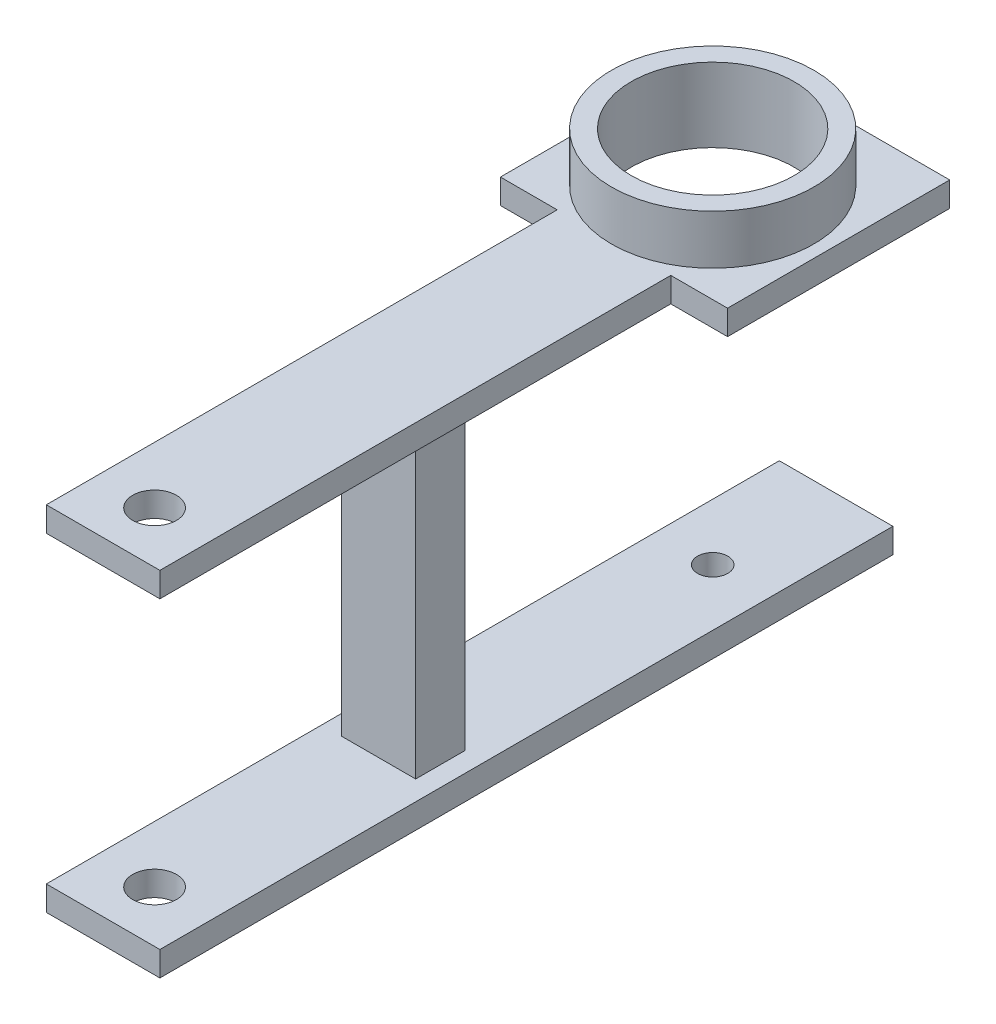
ISO-10303-21;
HEADER;
FILE_DESCRIPTION(('STEP AP214'),'2;1');
FILE_NAME('part.step','',(''),(''),'','','');
FILE_SCHEMA(('AUTOMOTIVE_DESIGN { 1 0 10303 214 1 1 1 1 }'));
ENDSEC;
DATA;
#1=APPLICATION_CONTEXT('core data for automotive mechanical design processes');
#2=APPLICATION_PROTOCOL_DEFINITION('international standard','automotive_design',2000,#1);
#3=PRODUCT_CONTEXT('',#1,'mechanical');
#4=PRODUCT('Part','Part','',(#3));
#5=PRODUCT_RELATED_PRODUCT_CATEGORY('part','',(#4));
#6=PRODUCT_DEFINITION_FORMATION('','',#4);
#7=PRODUCT_DEFINITION_CONTEXT('part definition',#1,'design');
#8=PRODUCT_DEFINITION('design','',#6,#7);
#9=PRODUCT_DEFINITION_SHAPE('','',#8);
#10=(LENGTH_UNIT() NAMED_UNIT(*) SI_UNIT(.MILLI.,.METRE.));
#11=(NAMED_UNIT(*) PLANE_ANGLE_UNIT() SI_UNIT($,.RADIAN.));
#12=(NAMED_UNIT(*) SI_UNIT($,.STERADIAN.) SOLID_ANGLE_UNIT());
#13=UNCERTAINTY_MEASURE_WITH_UNIT(LENGTH_MEASURE(1.E-05),#10,'distance_accuracy_value','');
#14=(GEOMETRIC_REPRESENTATION_CONTEXT(3) GLOBAL_UNCERTAINTY_ASSIGNED_CONTEXT((#13)) GLOBAL_UNIT_ASSIGNED_CONTEXT((#10,
#11,#12)) REPRESENTATION_CONTEXT('',''));
#15=CARTESIAN_POINT('',(0.,0.,0.));
#16=DIRECTION('',(0.,0.,1.));
#17=DIRECTION('',(1.,0.,0.));
#18=AXIS2_PLACEMENT_3D('',#15,#16,#17);
#19=CARTESIAN_POINT('',(0.,5.,-25.));
#20=DIRECTION('',(0.,0.,-1.));
#21=DIRECTION('',(-1.,0.,0.));
#22=AXIS2_PLACEMENT_3D('',#19,#20,#21);
#23=PLANE('',#22);
#24=DIRECTION('',(1.,0.,0.));
#25=VECTOR('',#24,1.);
#26=CARTESIAN_POINT('',(0.,0.,-25.));
#27=LINE('',#26,#25);
#28=CARTESIAN_POINT('',(-11.5,0.,-25.));
#29=VERTEX_POINT('',#28);
#30=CARTESIAN_POINT('',(11.5,0.,-25.));
#31=VERTEX_POINT('',#30);
#32=EDGE_CURVE('E252',#29,#31,#27,.T.);
#33=ORIENTED_EDGE('',*,*,#32,.F.);
#34=DIRECTION('',(0.,1.,0.));
#35=VECTOR('',#34,1.);
#36=CARTESIAN_POINT('',(-11.5,-5.,-25.));
#37=LINE('',#36,#35);
#38=CARTESIAN_POINT('',(-11.5,5.,-25.));
#39=VERTEX_POINT('',#38);
#40=EDGE_CURVE('E180',#29,#39,#37,.T.);
#41=ORIENTED_EDGE('',*,*,#40,.T.);
#42=DIRECTION('',(1.,0.,0.));
#43=VECTOR('',#42,1.);
#44=CARTESIAN_POINT('',(0.,5.,-25.));
#45=LINE('',#44,#43);
#46=CARTESIAN_POINT('',(11.5,5.,-25.));
#47=VERTEX_POINT('',#46);
#48=EDGE_CURVE('E253',#39,#47,#45,.T.);
#49=ORIENTED_EDGE('',*,*,#48,.T.);
#50=DIRECTION('',(0.,1.,0.));
#51=VECTOR('',#50,1.);
#52=CARTESIAN_POINT('',(11.5,-5.,-25.));
#53=LINE('',#52,#51);
#54=EDGE_CURVE('E181',#31,#47,#53,.T.);
#55=ORIENTED_EDGE('',*,*,#54,.F.);
#56=EDGE_LOOP('',(#33,#41,#49,#55));
#57=FACE_BOUND('',#56,.T.);
#58=ADVANCED_FACE('F37',(#57),#23,.T.);
#59=CARTESIAN_POINT('',(0.,5.,0.));
#60=DIRECTION('',(0.,1.,0.));
#61=DIRECTION('',(0.,0.,1.));
#62=AXIS2_PLACEMENT_3D('',#59,#60,#61);
#63=PLANE('',#62);
#64=DIRECTION('',(-1.,0.,0.));
#65=VECTOR('',#64,1.);
#66=CARTESIAN_POINT('',(0.,5.,123.455));
#67=LINE('',#66,#65);
#68=CARTESIAN_POINT('',(11.5,5.,123.455));
#69=VERTEX_POINT('',#68);
#70=CARTESIAN_POINT('',(-11.5,5.,123.455));
#71=VERTEX_POINT('',#70);
#72=EDGE_CURVE('E58',#69,#71,#67,.T.);
#73=ORIENTED_EDGE('',*,*,#72,.F.);
#74=DIRECTION('',(0.,0.,1.));
#75=VECTOR('',#74,1.);
#76=CARTESIAN_POINT('',(11.5,5.,0.));
#77=LINE('',#76,#75);
#78=EDGE_CURVE('E176',#47,#69,#77,.T.);
#79=ORIENTED_EDGE('',*,*,#78,.F.);
#80=ORIENTED_EDGE('',*,*,#48,.F.);
#81=DIRECTION('',(0.,0.,1.));
#82=VECTOR('',#81,1.);
#83=CARTESIAN_POINT('',(-11.5,5.,0.));
#84=LINE('',#83,#82);
#85=EDGE_CURVE('E177',#39,#71,#84,.T.);
#86=ORIENTED_EDGE('',*,*,#85,.T.);
#87=EDGE_LOOP('',(#73,#79,#80,#86));
#88=FACE_BOUND('',#87,.T.);
#89=DIRECTION('',(1.,0.,0.));
#90=VECTOR('',#89,1.);
#91=CARTESIAN_POINT('',(0.,5.,67.65));
#92=LINE('',#91,#90);
#93=CARTESIAN_POINT('',(-7.5,5.,67.65));
#94=VERTEX_POINT('',#93);
#95=CARTESIAN_POINT('',(7.5,5.,67.65));
#96=VERTEX_POINT('',#95);
#97=EDGE_CURVE('E220',#94,#96,#92,.T.);
#98=ORIENTED_EDGE('',*,*,#97,.F.);
#99=DIRECTION('',(0.,0.,-1.));
#100=VECTOR('',#99,1.);
#101=CARTESIAN_POINT('',(-7.5,5.,0.));
#102=LINE('',#101,#100);
#103=CARTESIAN_POINT('',(-7.5,5.,57.65));
#104=VERTEX_POINT('',#103);
#105=EDGE_CURVE('E238',#94,#104,#102,.T.);
#106=ORIENTED_EDGE('',*,*,#105,.T.);
#107=DIRECTION('',(1.,0.,0.));
#108=VECTOR('',#107,1.);
#109=CARTESIAN_POINT('',(0.,5.,57.65));
#110=LINE('',#109,#108);
#111=CARTESIAN_POINT('',(7.5,5.,57.65));
#112=VERTEX_POINT('',#111);
#113=EDGE_CURVE('E236',#104,#112,#110,.T.);
#114=ORIENTED_EDGE('',*,*,#113,.T.);
#115=DIRECTION('',(0.,0.,-1.));
#116=VECTOR('',#115,1.);
#117=CARTESIAN_POINT('',(7.5,5.,0.));
#118=LINE('',#117,#116);
#119=EDGE_CURVE('E233',#96,#112,#118,.T.);
#120=ORIENTED_EDGE('',*,*,#119,.F.);
#121=EDGE_LOOP('',(#98,#106,#114,#120));
#122=FACE_BOUND('',#121,.T.);
#123=CARTESIAN_POINT('',(0.,5.,113.03));
#124=DIRECTION('',(0.,1.,0.));
#125=DIRECTION('',(0.,0.,1.));
#126=AXIS2_PLACEMENT_3D('',#123,#124,#125);
#127=CIRCLE('',#126,4.425);
#128=CARTESIAN_POINT('',(0.,5.,117.455));
#129=VERTEX_POINT('',#128);
#130=EDGE_CURVE('E256',#129,#129,#127,.T.);
#131=ORIENTED_EDGE('',*,*,#130,.F.);
#132=EDGE_LOOP('',(#131));
#133=FACE_BOUND('',#132,.T.);
#134=CARTESIAN_POINT('',(0.,5.,0.));
#135=DIRECTION('',(0.,1.,0.));
#136=DIRECTION('',(0.,0.,1.));
#137=AXIS2_PLACEMENT_3D('',#134,#135,#136);
#138=CIRCLE('',#137,3.05);
#139=CARTESIAN_POINT('',(0.,5.,3.05));
#140=VERTEX_POINT('',#139);
#141=EDGE_CURVE('E260',#140,#140,#138,.T.);
#142=ORIENTED_EDGE('',*,*,#141,.F.);
#143=EDGE_LOOP('',(#142));
#144=FACE_BOUND('',#143,.T.);
#145=ADVANCED_FACE('F299',(#88,#122,#133,#144),#63,.T.);
#146=CARTESIAN_POINT('',(0.,0.,0.));
#147=DIRECTION('',(0.,1.,0.));
#148=DIRECTION('',(0.,0.,1.));
#149=AXIS2_PLACEMENT_3D('',#146,#147,#148);
#150=PLANE('',#149);
#151=CARTESIAN_POINT('',(0.,0.,0.));
#152=DIRECTION('',(0.,1.,0.));
#153=DIRECTION('',(0.,0.,1.));
#154=AXIS2_PLACEMENT_3D('',#151,#152,#153);
#155=CIRCLE('',#154,3.05);
#156=CARTESIAN_POINT('',(0.,0.,3.05));
#157=VERTEX_POINT('',#156);
#158=EDGE_CURVE('E257',#157,#157,#155,.T.);
#159=ORIENTED_EDGE('',*,*,#158,.T.);
#160=EDGE_LOOP('',(#159));
#161=FACE_BOUND('',#160,.T.);
#162=CARTESIAN_POINT('',(0.,0.,113.03));
#163=DIRECTION('',(0.,1.,0.));
#164=DIRECTION('',(0.,0.,1.));
#165=AXIS2_PLACEMENT_3D('',#162,#163,#164);
#166=CIRCLE('',#165,4.425);
#167=CARTESIAN_POINT('',(0.,0.,117.455));
#168=VERTEX_POINT('',#167);
#169=EDGE_CURVE('E266',#168,#168,#166,.T.);
#170=ORIENTED_EDGE('',*,*,#169,.T.);
#171=EDGE_LOOP('',(#170));
#172=FACE_BOUND('',#171,.T.);
#173=DIRECTION('',(0.,0.,1.));
#174=VECTOR('',#173,1.);
#175=CARTESIAN_POINT('',(11.5,0.,0.));
#176=LINE('',#175,#174);
#177=CARTESIAN_POINT('',(11.5,0.,123.455));
#178=VERTEX_POINT('',#177);
#179=EDGE_CURVE('E263',#31,#178,#176,.T.);
#180=ORIENTED_EDGE('',*,*,#179,.T.);
#181=DIRECTION('',(-1.,0.,0.));
#182=VECTOR('',#181,1.);
#183=CARTESIAN_POINT('',(0.,0.,123.455));
#184=LINE('',#183,#182);
#185=CARTESIAN_POINT('',(-11.5,0.,123.455));
#186=VERTEX_POINT('',#185);
#187=EDGE_CURVE('E284',#178,#186,#184,.T.);
#188=ORIENTED_EDGE('',*,*,#187,.T.);
#189=DIRECTION('',(0.,0.,1.));
#190=VECTOR('',#189,1.);
#191=CARTESIAN_POINT('',(-11.5,0.,0.));
#192=LINE('',#191,#190);
#193=EDGE_CURVE('E273',#29,#186,#192,.T.);
#194=ORIENTED_EDGE('',*,*,#193,.F.);
#195=ORIENTED_EDGE('',*,*,#32,.T.);
#196=EDGE_LOOP('',(#180,#188,#194,#195));
#197=FACE_BOUND('',#196,.T.);
#198=ADVANCED_FACE('F289',(#161,#172,#197),#150,.F.);
#199=CARTESIAN_POINT('',(0.,5.,113.03));
#200=DIRECTION('',(0.,-1.,0.));
#201=DIRECTION('',(0.,0.,-1.));
#202=AXIS2_PLACEMENT_3D('',#199,#200,#201);
#203=CYLINDRICAL_SURFACE('',#202,4.425);
#204=ORIENTED_EDGE('',*,*,#130,.T.);
#205=EDGE_LOOP('',(#204));
#206=FACE_BOUND('',#205,.T.);
#207=ORIENTED_EDGE('',*,*,#169,.F.);
#208=EDGE_LOOP('',(#207));
#209=FACE_BOUND('',#208,.T.);
#210=ADVANCED_FACE('F369',(#206,#209),#203,.F.);
#211=CARTESIAN_POINT('',(0.,5.,0.));
#212=DIRECTION('',(0.,-1.,0.));
#213=DIRECTION('',(0.,0.,-1.));
#214=AXIS2_PLACEMENT_3D('',#211,#212,#213);
#215=CYLINDRICAL_SURFACE('',#214,3.05);
#216=ORIENTED_EDGE('',*,*,#141,.T.);
#217=EDGE_LOOP('',(#216));
#218=FACE_BOUND('',#217,.T.);
#219=ORIENTED_EDGE('',*,*,#158,.F.);
#220=EDGE_LOOP('',(#219));
#221=FACE_BOUND('',#220,.T.);
#222=ADVANCED_FACE('F376',(#218,#221),#215,.F.);
#223=CARTESIAN_POINT('',(0.,84.52775637732,67.65));
#224=DIRECTION('',(0.,0.,-1.));
#225=DIRECTION('',(-1.,0.,0.));
#226=AXIS2_PLACEMENT_3D('',#223,#224,#225);
#227=PLANE('',#226);
#228=DIRECTION('',(0.,-1.,0.));
#229=VECTOR('',#228,1.);
#230=CARTESIAN_POINT('',(7.5,84.52775637732,67.65));
#231=LINE('',#230,#229);
#232=CARTESIAN_POINT('',(7.5,66.5,67.65));
#233=VERTEX_POINT('',#232);
#234=EDGE_CURVE('E224',#233,#96,#231,.T.);
#235=ORIENTED_EDGE('',*,*,#234,.F.);
#236=DIRECTION('',(-1.,0.,0.));
#237=VECTOR('',#236,1.);
#238=CARTESIAN_POINT('',(0.,66.5,67.65));
#239=LINE('',#238,#237);
#240=CARTESIAN_POINT('',(-7.5,66.5,67.65));
#241=VERTEX_POINT('',#240);
#242=EDGE_CURVE('E227',#233,#241,#239,.T.);
#243=ORIENTED_EDGE('',*,*,#242,.T.);
#244=DIRECTION('',(0.,-1.,0.));
#245=VECTOR('',#244,1.);
#246=CARTESIAN_POINT('',(-7.5,84.52775637732,67.65));
#247=LINE('',#246,#245);
#248=EDGE_CURVE('E240',#241,#94,#247,.T.);
#249=ORIENTED_EDGE('',*,*,#248,.T.);
#250=ORIENTED_EDGE('',*,*,#97,.T.);
#251=EDGE_LOOP('',(#235,#243,#249,#250));
#252=FACE_BOUND('',#251,.T.);
#253=ADVANCED_FACE('F373',(#252),#227,.F.);
#254=CARTESIAN_POINT('',(7.5,84.52775637732,0.));
#255=DIRECTION('',(-1.,0.,0.));
#256=DIRECTION('',(0.,0.,1.));
#257=AXIS2_PLACEMENT_3D('',#254,#255,#256);
#258=PLANE('',#257);
#259=DIRECTION('',(0.,-1.,0.));
#260=VECTOR('',#259,1.);
#261=CARTESIAN_POINT('',(7.5,84.52775637732,57.65));
#262=LINE('',#261,#260);
#263=CARTESIAN_POINT('',(7.5,66.5,57.65));
#264=VERTEX_POINT('',#263);
#265=EDGE_CURVE('E246',#264,#112,#262,.T.);
#266=ORIENTED_EDGE('',*,*,#265,.F.);
#267=DIRECTION('',(0.,0.,1.));
#268=VECTOR('',#267,1.);
#269=CARTESIAN_POINT('',(7.5,66.5,0.));
#270=LINE('',#269,#268);
#271=EDGE_CURVE('E223',#264,#233,#270,.T.);
#272=ORIENTED_EDGE('',*,*,#271,.T.);
#273=ORIENTED_EDGE('',*,*,#234,.T.);
#274=ORIENTED_EDGE('',*,*,#119,.T.);
#275=EDGE_LOOP('',(#266,#272,#273,#274));
#276=FACE_BOUND('',#275,.T.);
#277=ADVANCED_FACE('F405',(#276),#258,.F.);
#278=CARTESIAN_POINT('',(0.,84.52775637732,57.65));
#279=DIRECTION('',(0.,0.,-1.));
#280=DIRECTION('',(-1.,0.,0.));
#281=AXIS2_PLACEMENT_3D('',#278,#279,#280);
#282=PLANE('',#281);
#283=DIRECTION('',(-1.,0.,0.));
#284=VECTOR('',#283,1.);
#285=CARTESIAN_POINT('',(0.,66.5,57.65));
#286=LINE('',#285,#284);
#287=CARTESIAN_POINT('',(-7.5,66.5,57.65));
#288=VERTEX_POINT('',#287);
#289=EDGE_CURVE('E221',#264,#288,#286,.T.);
#290=ORIENTED_EDGE('',*,*,#289,.F.);
#291=ORIENTED_EDGE('',*,*,#265,.T.);
#292=ORIENTED_EDGE('',*,*,#113,.F.);
#293=DIRECTION('',(0.,-1.,0.));
#294=VECTOR('',#293,1.);
#295=CARTESIAN_POINT('',(-7.5,84.52775637732,57.65));
#296=LINE('',#295,#294);
#297=EDGE_CURVE('E243',#288,#104,#296,.T.);
#298=ORIENTED_EDGE('',*,*,#297,.F.);
#299=EDGE_LOOP('',(#290,#291,#292,#298));
#300=FACE_BOUND('',#299,.T.);
#301=ADVANCED_FACE('F412',(#300),#282,.T.);
#302=CARTESIAN_POINT('',(-7.5,84.52775637732,0.));
#303=DIRECTION('',(-1.,0.,0.));
#304=DIRECTION('',(0.,0.,1.));
#305=AXIS2_PLACEMENT_3D('',#302,#303,#304);
#306=PLANE('',#305);
#307=DIRECTION('',(0.,0.,1.));
#308=VECTOR('',#307,1.);
#309=CARTESIAN_POINT('',(-7.5,66.5,0.));
#310=LINE('',#309,#308);
#311=EDGE_CURVE('E230',#288,#241,#310,.T.);
#312=ORIENTED_EDGE('',*,*,#311,.F.);
#313=ORIENTED_EDGE('',*,*,#297,.T.);
#314=ORIENTED_EDGE('',*,*,#105,.F.);
#315=ORIENTED_EDGE('',*,*,#248,.F.);
#316=EDGE_LOOP('',(#312,#313,#314,#315));
#317=FACE_BOUND('',#316,.T.);
#318=ADVANCED_FACE('F419',(#317),#306,.T.);
#319=CARTESIAN_POINT('',(0.,66.5,0.));
#320=DIRECTION('',(0.,-1.,0.));
#321=DIRECTION('',(0.,0.,-1.));
#322=AXIS2_PLACEMENT_3D('',#319,#320,#321);
#323=PLANE('',#322);
#324=DIRECTION('',(1.,0.,0.));
#325=VECTOR('',#324,1.);
#326=CARTESIAN_POINT('',(0.,66.5,123.455));
#327=LINE('',#326,#325);
#328=CARTESIAN_POINT('',(-11.5,66.5,123.455));
#329=VERTEX_POINT('',#328);
#330=CARTESIAN_POINT('',(11.5,66.5,123.455));
#331=VERTEX_POINT('',#330);
#332=EDGE_CURVE('E51',#329,#331,#327,.T.);
#333=ORIENTED_EDGE('',*,*,#332,.F.);
#334=DIRECTION('',(0.,0.,1.));
#335=VECTOR('',#334,1.);
#336=CARTESIAN_POINT('',(-11.5,66.5,19.9873698088721));
#337=LINE('',#336,#335);
#338=CARTESIAN_POINT('',(-11.5,66.5,19.9873698088721));
#339=VERTEX_POINT('',#338);
#340=EDGE_CURVE('E309',#339,#329,#337,.T.);
#341=ORIENTED_EDGE('',*,*,#340,.F.);
#342=DIRECTION('',(1.,0.,0.));
#343=VECTOR('',#342,1.);
#344=CARTESIAN_POINT('',(-23.,66.5,19.9873698088721));
#345=LINE('',#344,#343);
#346=CARTESIAN_POINT('',(-23.,66.5,19.9873698088721));
#347=VERTEX_POINT('',#346);
#348=EDGE_CURVE('E312',#347,#339,#345,.T.);
#349=ORIENTED_EDGE('',*,*,#348,.F.);
#350=DIRECTION('',(0.,0.,1.));
#351=VECTOR('',#350,1.);
#352=CARTESIAN_POINT('',(-23.,66.5,-25.));
#353=LINE('',#352,#351);
#354=CARTESIAN_POINT('',(-23.,66.5,-25.));
#355=VERTEX_POINT('',#354);
#356=EDGE_CURVE('E203',#355,#347,#353,.T.);
#357=ORIENTED_EDGE('',*,*,#356,.F.);
#358=DIRECTION('',(-1.,0.,0.));
#359=VECTOR('',#358,1.);
#360=CARTESIAN_POINT('',(23.,66.5,-25.));
#361=LINE('',#360,#359);
#362=CARTESIAN_POINT('',(23.,66.5,-25.));
#363=VERTEX_POINT('',#362);
#364=EDGE_CURVE('E199',#363,#355,#361,.T.);
#365=ORIENTED_EDGE('',*,*,#364,.F.);
#366=DIRECTION('',(0.,0.,-1.));
#367=VECTOR('',#366,1.);
#368=CARTESIAN_POINT('',(23.,66.5,-25.));
#369=LINE('',#368,#367);
#370=CARTESIAN_POINT('',(23.,66.5,19.9873698088721));
#371=VERTEX_POINT('',#370);
#372=EDGE_CURVE('E197',#371,#363,#369,.T.);
#373=ORIENTED_EDGE('',*,*,#372,.F.);
#374=DIRECTION('',(1.,0.,0.));
#375=VECTOR('',#374,1.);
#376=CARTESIAN_POINT('',(23.,66.5,19.9873698088721));
#377=LINE('',#376,#375);
#378=CARTESIAN_POINT('',(11.5,66.5,19.9873698088721));
#379=VERTEX_POINT('',#378);
#380=EDGE_CURVE('E318',#379,#371,#377,.T.);
#381=ORIENTED_EDGE('',*,*,#380,.F.);
#382=DIRECTION('',(0.,0.,-1.));
#383=VECTOR('',#382,1.);
#384=CARTESIAN_POINT('',(11.5,66.5,19.9873698088721));
#385=LINE('',#384,#383);
#386=EDGE_CURVE('E280',#331,#379,#385,.T.);
#387=ORIENTED_EDGE('',*,*,#386,.F.);
#388=EDGE_LOOP('',(#333,#341,#349,#357,#365,#373,#381,#387));
#389=FACE_BOUND('',#388,.T.);
#390=CARTESIAN_POINT('',(0.,66.5,113.03));
#391=DIRECTION('',(0.,-1.,0.));
#392=DIRECTION('',(0.,0.,-1.));
#393=AXIS2_PLACEMENT_3D('',#390,#391,#392);
#394=CIRCLE('',#393,4.42499999999999);
#395=CARTESIAN_POINT('',(0.,66.5,108.605));
#396=VERTEX_POINT('',#395);
#397=EDGE_CURVE('E281',#396,#396,#394,.T.);
#398=ORIENTED_EDGE('',*,*,#397,.F.);
#399=EDGE_LOOP('',(#398));
#400=FACE_BOUND('',#399,.T.);
#401=CARTESIAN_POINT('',(0.,66.5,0.));
#402=DIRECTION('',(0.,1.,0.));
#403=DIRECTION('',(0.,0.,1.));
#404=AXIS2_PLACEMENT_3D('',#401,#402,#403);
#405=CIRCLE('',#404,16.5);
#406=CARTESIAN_POINT('',(0.,66.5,16.5));
#407=VERTEX_POINT('',#406);
#408=EDGE_CURVE('E193',#407,#407,#405,.T.);
#409=ORIENTED_EDGE('',*,*,#408,.T.);
#410=EDGE_LOOP('',(#409));
#411=FACE_BOUND('',#410,.T.);
#412=ORIENTED_EDGE('',*,*,#271,.F.);
#413=ORIENTED_EDGE('',*,*,#289,.T.);
#414=ORIENTED_EDGE('',*,*,#311,.T.);
#415=ORIENTED_EDGE('',*,*,#242,.F.);
#416=EDGE_LOOP('',(#412,#413,#414,#415));
#417=FACE_BOUND('',#416,.T.);
#418=ADVANCED_FACE('F326',(#389,#400,#411,#417),#323,.T.);
#419=CARTESIAN_POINT('',(0.,71.5,0.));
#420=DIRECTION('',(0.,-1.,0.));
#421=DIRECTION('',(0.,0.,-1.));
#422=AXIS2_PLACEMENT_3D('',#419,#420,#421);
#423=PLANE('',#422);
#424=CARTESIAN_POINT('',(0.,71.5,113.03));
#425=DIRECTION('',(0.,-1.,0.));
#426=DIRECTION('',(0.,0.,-1.));
#427=AXIS2_PLACEMENT_3D('',#424,#425,#426);
#428=CIRCLE('',#427,4.42499999999999);
#429=CARTESIAN_POINT('',(0.,71.5,108.605));
#430=VERTEX_POINT('',#429);
#431=EDGE_CURVE('E278',#430,#430,#428,.T.);
#432=ORIENTED_EDGE('',*,*,#431,.T.);
#433=EDGE_LOOP('',(#432));
#434=FACE_BOUND('',#433,.T.);
#435=DIRECTION('',(0.,0.,1.));
#436=VECTOR('',#435,1.);
#437=CARTESIAN_POINT('',(-11.5,71.5,0.));
#438=LINE('',#437,#436);
#439=CARTESIAN_POINT('',(-11.5,71.5,19.9873698088721));
#440=VERTEX_POINT('',#439);
#441=CARTESIAN_POINT('',(-11.5,71.5,123.455));
#442=VERTEX_POINT('',#441);
#443=EDGE_CURVE('E160',#440,#442,#438,.T.);
#444=ORIENTED_EDGE('',*,*,#443,.T.);
#445=DIRECTION('',(-1.,0.,0.));
#446=VECTOR('',#445,1.);
#447=CARTESIAN_POINT('',(0.,71.5,123.455));
#448=LINE('',#447,#446);
#449=CARTESIAN_POINT('',(11.5,71.5,123.455));
#450=VERTEX_POINT('',#449);
#451=EDGE_CURVE('E147',#450,#442,#448,.T.);
#452=ORIENTED_EDGE('',*,*,#451,.F.);
#453=DIRECTION('',(0.,0.,-1.));
#454=VECTOR('',#453,1.);
#455=CARTESIAN_POINT('',(11.5,71.5,0.));
#456=LINE('',#455,#454);
#457=CARTESIAN_POINT('',(11.5,71.5,19.9873698088721));
#458=VERTEX_POINT('',#457);
#459=EDGE_CURVE('E157',#450,#458,#456,.T.);
#460=ORIENTED_EDGE('',*,*,#459,.T.);
#461=DIRECTION('',(1.,0.,0.));
#462=VECTOR('',#461,1.);
#463=CARTESIAN_POINT('',(0.,71.5,19.9873698088721));
#464=LINE('',#463,#462);
#465=CARTESIAN_POINT('',(23.,71.5,19.9873698088721));
#466=VERTEX_POINT('',#465);
#467=EDGE_CURVE('E169',#458,#466,#464,.T.);
#468=ORIENTED_EDGE('',*,*,#467,.T.);
#469=DIRECTION('',(0.,0.,-1.));
#470=VECTOR('',#469,1.);
#471=CARTESIAN_POINT('',(23.,71.5,-25.));
#472=LINE('',#471,#470);
#473=CARTESIAN_POINT('',(23.,71.5,-25.));
#474=VERTEX_POINT('',#473);
#475=EDGE_CURVE('E196',#466,#474,#472,.T.);
#476=ORIENTED_EDGE('',*,*,#475,.T.);
#477=DIRECTION('',(-1.,0.,0.));
#478=VECTOR('',#477,1.);
#479=CARTESIAN_POINT('',(23.,71.5,-25.));
#480=LINE('',#479,#478);
#481=CARTESIAN_POINT('',(-23.,71.5,-25.));
#482=VERTEX_POINT('',#481);
#483=EDGE_CURVE('E208',#474,#482,#480,.T.);
#484=ORIENTED_EDGE('',*,*,#483,.T.);
#485=DIRECTION('',(0.,0.,1.));
#486=VECTOR('',#485,1.);
#487=CARTESIAN_POINT('',(-23.,71.5,-25.));
#488=LINE('',#487,#486);
#489=CARTESIAN_POINT('',(-23.,71.5,19.9873698088721));
#490=VERTEX_POINT('',#489);
#491=EDGE_CURVE('E200',#482,#490,#488,.T.);
#492=ORIENTED_EDGE('',*,*,#491,.T.);
#493=DIRECTION('',(1.,0.,0.));
#494=VECTOR('',#493,1.);
#495=CARTESIAN_POINT('',(0.,71.5,19.9873698088721));
#496=LINE('',#495,#494);
#497=EDGE_CURVE('E167',#490,#440,#496,.T.);
#498=ORIENTED_EDGE('',*,*,#497,.T.);
#499=EDGE_LOOP('',(#444,#452,#460,#468,#476,#484,#492,#498));
#500=FACE_BOUND('',#499,.T.);
#501=CARTESIAN_POINT('',(0.,71.5,0.));
#502=DIRECTION('',(0.,-1.,0.));
#503=DIRECTION('',(0.,0.,-1.));
#504=AXIS2_PLACEMENT_3D('',#501,#502,#503);
#505=CIRCLE('',#504,20.5);
#506=CARTESIAN_POINT('',(0.,71.5,-20.5));
#507=VERTEX_POINT('',#506);
#508=EDGE_CURVE('E215',#507,#507,#505,.F.);
#509=ORIENTED_EDGE('',*,*,#508,.F.);
#510=EDGE_LOOP('',(#509));
#511=FACE_BOUND('',#510,.T.);
#512=ADVANCED_FACE('F154',(#434,#500,#511),#423,.F.);
#513=CARTESIAN_POINT('',(23.,66.5,-25.));
#514=DIRECTION('',(1.,0.,0.));
#515=DIRECTION('',(0.,0.,-1.));
#516=AXIS2_PLACEMENT_3D('',#513,#514,#515);
#517=PLANE('',#516);
#518=DIRECTION('',(0.,-1.,0.));
#519=VECTOR('',#518,1.);
#520=CARTESIAN_POINT('',(23.,76.5,19.9873698088721));
#521=LINE('',#520,#519);
#522=EDGE_CURVE('E313',#466,#371,#521,.T.);
#523=ORIENTED_EDGE('',*,*,#522,.T.);
#524=ORIENTED_EDGE('',*,*,#372,.T.);
#525=DIRECTION('',(0.,1.,0.));
#526=VECTOR('',#525,1.);
#527=CARTESIAN_POINT('',(23.,66.5,-25.));
#528=LINE('',#527,#526);
#529=EDGE_CURVE('E206',#363,#474,#528,.T.);
#530=ORIENTED_EDGE('',*,*,#529,.T.);
#531=ORIENTED_EDGE('',*,*,#475,.F.);
#532=EDGE_LOOP('',(#523,#524,#530,#531));
#533=FACE_BOUND('',#532,.T.);
#534=ADVANCED_FACE('F332',(#533),#517,.T.);
#535=CARTESIAN_POINT('',(-23.,66.5,-25.));
#536=DIRECTION('',(-1.,0.,0.));
#537=DIRECTION('',(0.,0.,1.));
#538=AXIS2_PLACEMENT_3D('',#535,#536,#537);
#539=PLANE('',#538);
#540=DIRECTION('',(0.,-1.,0.));
#541=VECTOR('',#540,1.);
#542=CARTESIAN_POINT('',(-23.,66.5,19.9873698088721));
#543=LINE('',#542,#541);
#544=EDGE_CURVE('E276',#490,#347,#543,.T.);
#545=ORIENTED_EDGE('',*,*,#544,.F.);
#546=ORIENTED_EDGE('',*,*,#491,.F.);
#547=DIRECTION('',(0.,1.,0.));
#548=VECTOR('',#547,1.);
#549=CARTESIAN_POINT('',(-23.,66.5,-25.));
#550=LINE('',#549,#548);
#551=EDGE_CURVE('E213',#355,#482,#550,.T.);
#552=ORIENTED_EDGE('',*,*,#551,.F.);
#553=ORIENTED_EDGE('',*,*,#356,.T.);
#554=EDGE_LOOP('',(#545,#546,#552,#553));
#555=FACE_BOUND('',#554,.T.);
#556=ADVANCED_FACE('F340',(#555),#539,.T.);
#557=CARTESIAN_POINT('',(23.,66.5,-25.));
#558=DIRECTION('',(0.,0.,-1.));
#559=DIRECTION('',(-1.,0.,0.));
#560=AXIS2_PLACEMENT_3D('',#557,#558,#559);
#561=PLANE('',#560);
#562=ORIENTED_EDGE('',*,*,#483,.F.);
#563=ORIENTED_EDGE('',*,*,#529,.F.);
#564=ORIENTED_EDGE('',*,*,#364,.T.);
#565=ORIENTED_EDGE('',*,*,#551,.T.);
#566=EDGE_LOOP('',(#562,#563,#564,#565));
#567=FACE_BOUND('',#566,.T.);
#568=ADVANCED_FACE('F336',(#567),#561,.T.);
#569=CARTESIAN_POINT('',(0.,66.5,0.));
#570=DIRECTION('',(0.,1.,0.));
#571=DIRECTION('',(0.,0.,1.));
#572=AXIS2_PLACEMENT_3D('',#569,#570,#571);
#573=CYLINDRICAL_SURFACE('',#572,16.5);
#574=ORIENTED_EDGE('',*,*,#408,.F.);
#575=EDGE_LOOP('',(#574));
#576=FACE_BOUND('',#575,.T.);
#577=CARTESIAN_POINT('',(0.,81.5,0.));
#578=DIRECTION('',(0.,1.,0.));
#579=DIRECTION('',(0.,0.,1.));
#580=AXIS2_PLACEMENT_3D('',#577,#578,#579);
#581=CIRCLE('',#580,16.5);
#582=CARTESIAN_POINT('',(0.,81.5,16.5));
#583=VERTEX_POINT('',#582);
#584=EDGE_CURVE('E184',#583,#583,#581,.T.);
#585=ORIENTED_EDGE('',*,*,#584,.T.);
#586=EDGE_LOOP('',(#585));
#587=FACE_BOUND('',#586,.T.);
#588=ADVANCED_FACE('F464',(#576,#587),#573,.F.);
#589=CARTESIAN_POINT('',(0.,81.5,0.));
#590=DIRECTION('',(0.,1.,0.));
#591=DIRECTION('',(0.,0.,1.));
#592=AXIS2_PLACEMENT_3D('',#589,#590,#591);
#593=PLANE('',#592);
#594=CARTESIAN_POINT('',(0.,81.5,0.));
#595=DIRECTION('',(0.,1.,0.));
#596=DIRECTION('',(0.,0.,1.));
#597=AXIS2_PLACEMENT_3D('',#594,#595,#596);
#598=CIRCLE('',#597,20.5);
#599=CARTESIAN_POINT('',(0.,81.5,20.5));
#600=VERTEX_POINT('',#599);
#601=EDGE_CURVE('E190',#600,#600,#598,.T.);
#602=ORIENTED_EDGE('',*,*,#601,.T.);
#603=EDGE_LOOP('',(#602));
#604=FACE_BOUND('',#603,.T.);
#605=ORIENTED_EDGE('',*,*,#584,.F.);
#606=EDGE_LOOP('',(#605));
#607=FACE_BOUND('',#606,.T.);
#608=ADVANCED_FACE('F471',(#604,#607),#593,.T.);
#609=CARTESIAN_POINT('',(0.,81.5,0.));
#610=DIRECTION('',(0.,-1.,0.));
#611=DIRECTION('',(0.,0.,-1.));
#612=AXIS2_PLACEMENT_3D('',#609,#610,#611);
#613=CYLINDRICAL_SURFACE('',#612,20.5);
#614=ORIENTED_EDGE('',*,*,#601,.F.);
#615=EDGE_LOOP('',(#614));
#616=FACE_BOUND('',#615,.T.);
#617=ORIENTED_EDGE('',*,*,#508,.T.);
#618=EDGE_LOOP('',(#617));
#619=FACE_BOUND('',#618,.T.);
#620=ADVANCED_FACE('F479',(#616,#619),#613,.T.);
#621=CARTESIAN_POINT('',(11.5,-5.,0.));
#622=DIRECTION('',(-1.,0.,0.));
#623=DIRECTION('',(0.,0.,1.));
#624=AXIS2_PLACEMENT_3D('',#621,#622,#623);
#625=PLANE('',#624);
#626=ORIENTED_EDGE('',*,*,#78,.T.);
#627=DIRECTION('',(0.,1.,0.));
#628=VECTOR('',#627,1.);
#629=CARTESIAN_POINT('',(11.5,-5.,123.455));
#630=LINE('',#629,#628);
#631=EDGE_CURVE('E291',#178,#69,#630,.T.);
#632=ORIENTED_EDGE('',*,*,#631,.F.);
#633=ORIENTED_EDGE('',*,*,#179,.F.);
#634=ORIENTED_EDGE('',*,*,#54,.T.);
#635=EDGE_LOOP('',(#626,#632,#633,#634));
#636=FACE_BOUND('',#635,.T.);
#637=ADVANCED_FACE('F302',(#636),#625,.F.);
#638=CARTESIAN_POINT('',(-11.5,-5.,0.));
#639=DIRECTION('',(-1.,0.,0.));
#640=DIRECTION('',(0.,0.,1.));
#641=AXIS2_PLACEMENT_3D('',#638,#639,#640);
#642=PLANE('',#641);
#643=DIRECTION('',(0.,-1.,0.));
#644=VECTOR('',#643,1.);
#645=CARTESIAN_POINT('',(-11.5,-5.,123.455));
#646=LINE('',#645,#644);
#647=EDGE_CURVE('E44',#71,#186,#646,.T.);
#648=ORIENTED_EDGE('',*,*,#647,.F.);
#649=ORIENTED_EDGE('',*,*,#85,.F.);
#650=ORIENTED_EDGE('',*,*,#40,.F.);
#651=ORIENTED_EDGE('',*,*,#193,.T.);
#652=EDGE_LOOP('',(#648,#649,#650,#651));
#653=FACE_BOUND('',#652,.T.);
#654=ADVANCED_FACE('F293',(#653),#642,.T.);
#655=CARTESIAN_POINT('',(-11.5,76.5,19.9873698088721));
#656=DIRECTION('',(1.,0.,0.));
#657=DIRECTION('',(0.,0.,-1.));
#658=AXIS2_PLACEMENT_3D('',#655,#656,#657);
#659=PLANE('',#658);
#660=ORIENTED_EDGE('',*,*,#340,.T.);
#661=DIRECTION('',(0.,1.,0.));
#662=VECTOR('',#661,1.);
#663=CARTESIAN_POINT('',(-11.5,61.5,123.455));
#664=LINE('',#663,#662);
#665=EDGE_CURVE('E161',#329,#442,#664,.T.);
#666=ORIENTED_EDGE('',*,*,#665,.T.);
#667=ORIENTED_EDGE('',*,*,#443,.F.);
#668=DIRECTION('',(0.,-1.,0.));
#669=VECTOR('',#668,1.);
#670=CARTESIAN_POINT('',(-11.5,76.5,19.9873698088721));
#671=LINE('',#670,#669);
#672=EDGE_CURVE('E171',#440,#339,#671,.T.);
#673=ORIENTED_EDGE('',*,*,#672,.T.);
#674=EDGE_LOOP('',(#660,#666,#667,#673));
#675=FACE_BOUND('',#674,.T.);
#676=ADVANCED_FACE('F347',(#675),#659,.F.);
#677=CARTESIAN_POINT('',(-23.,76.5,19.9873698088721));
#678=DIRECTION('',(0.,0.,-1.));
#679=DIRECTION('',(-1.,0.,0.));
#680=AXIS2_PLACEMENT_3D('',#677,#678,#679);
#681=PLANE('',#680);
#682=ORIENTED_EDGE('',*,*,#544,.T.);
#683=ORIENTED_EDGE('',*,*,#348,.T.);
#684=ORIENTED_EDGE('',*,*,#672,.F.);
#685=ORIENTED_EDGE('',*,*,#497,.F.);
#686=EDGE_LOOP('',(#682,#683,#684,#685));
#687=FACE_BOUND('',#686,.T.);
#688=ADVANCED_FACE('F343',(#687),#681,.F.);
#689=CARTESIAN_POINT('',(23.,76.5,19.9873698088721));
#690=DIRECTION('',(0.,0.,-1.));
#691=DIRECTION('',(-1.,0.,0.));
#692=AXIS2_PLACEMENT_3D('',#689,#690,#691);
#693=PLANE('',#692);
#694=DIRECTION('',(0.,-1.,0.));
#695=VECTOR('',#694,1.);
#696=CARTESIAN_POINT('',(11.5,76.5,19.9873698088721));
#697=LINE('',#696,#695);
#698=EDGE_CURVE('E166',#458,#379,#697,.T.);
#699=ORIENTED_EDGE('',*,*,#698,.T.);
#700=ORIENTED_EDGE('',*,*,#380,.T.);
#701=ORIENTED_EDGE('',*,*,#522,.F.);
#702=ORIENTED_EDGE('',*,*,#467,.F.);
#703=EDGE_LOOP('',(#699,#700,#701,#702));
#704=FACE_BOUND('',#703,.T.);
#705=ADVANCED_FACE('F323',(#704),#693,.F.);
#706=CARTESIAN_POINT('',(11.5,76.5,19.9873698088721));
#707=DIRECTION('',(-1.,0.,0.));
#708=DIRECTION('',(0.,0.,1.));
#709=AXIS2_PLACEMENT_3D('',#706,#707,#708);
#710=PLANE('',#709);
#711=ORIENTED_EDGE('',*,*,#459,.F.);
#712=DIRECTION('',(0.,-1.,0.));
#713=VECTOR('',#712,1.);
#714=CARTESIAN_POINT('',(11.5,76.5,123.455));
#715=LINE('',#714,#713);
#716=EDGE_CURVE('E11',#450,#331,#715,.T.);
#717=ORIENTED_EDGE('',*,*,#716,.T.);
#718=ORIENTED_EDGE('',*,*,#386,.T.);
#719=ORIENTED_EDGE('',*,*,#698,.F.);
#720=EDGE_LOOP('',(#711,#717,#718,#719));
#721=FACE_BOUND('',#720,.T.);
#722=ADVANCED_FACE('F164',(#721),#710,.F.);
#723=CARTESIAN_POINT('',(0.,76.5,113.03));
#724=DIRECTION('',(0.,-1.,0.));
#725=DIRECTION('',(0.,0.,-1.));
#726=AXIS2_PLACEMENT_3D('',#723,#724,#725);
#727=CYLINDRICAL_SURFACE('',#726,4.42499999999999);
#728=ORIENTED_EDGE('',*,*,#397,.T.);
#729=EDGE_LOOP('',(#728));
#730=FACE_BOUND('',#729,.T.);
#731=ORIENTED_EDGE('',*,*,#431,.F.);
#732=EDGE_LOOP('',(#731));
#733=FACE_BOUND('',#732,.T.);
#734=ADVANCED_FACE('F522',(#730,#733),#727,.F.);
#735=CARTESIAN_POINT('',(0.,-5.,123.455));
#736=DIRECTION('',(0.,0.,-1.));
#737=DIRECTION('',(-1.,0.,0.));
#738=AXIS2_PLACEMENT_3D('',#735,#736,#737);
#739=PLANE('',#738);
#740=ORIENTED_EDGE('',*,*,#631,.T.);
#741=ORIENTED_EDGE('',*,*,#72,.T.);
#742=ORIENTED_EDGE('',*,*,#647,.T.);
#743=ORIENTED_EDGE('',*,*,#187,.F.);
#744=EDGE_LOOP('',(#740,#741,#742,#743));
#745=FACE_BOUND('',#744,.T.);
#746=ADVANCED_FACE('F283',(#745),#739,.F.);
#747=CARTESIAN_POINT('',(0.,61.5,123.455));
#748=DIRECTION('',(0.,0.,-1.));
#749=DIRECTION('',(-1.,0.,0.));
#750=AXIS2_PLACEMENT_3D('',#747,#748,#749);
#751=PLANE('',#750);
#752=ORIENTED_EDGE('',*,*,#332,.T.);
#753=ORIENTED_EDGE('',*,*,#716,.F.);
#754=ORIENTED_EDGE('',*,*,#451,.T.);
#755=ORIENTED_EDGE('',*,*,#665,.F.);
#756=EDGE_LOOP('',(#752,#753,#754,#755));
#757=FACE_BOUND('',#756,.T.);
#758=ADVANCED_FACE('F146',(#757),#751,.F.);
#759=CLOSED_SHELL('',(#58,#145,#198,#210,#222,#253,#277,#301,#318,#418,#512,#534,#556,#568,#588,
#608,#620,#637,#654,#676,#688,#705,#722,#734,#746,#758));
#760=MANIFOLD_SOLID_BREP('B2',#759);
#761=ADVANCED_BREP_SHAPE_REPRESENTATION('',(#18,#760),#14);
#762=SHAPE_DEFINITION_REPRESENTATION(#9,#761);
ENDSEC;
END-ISO-10303-21;
